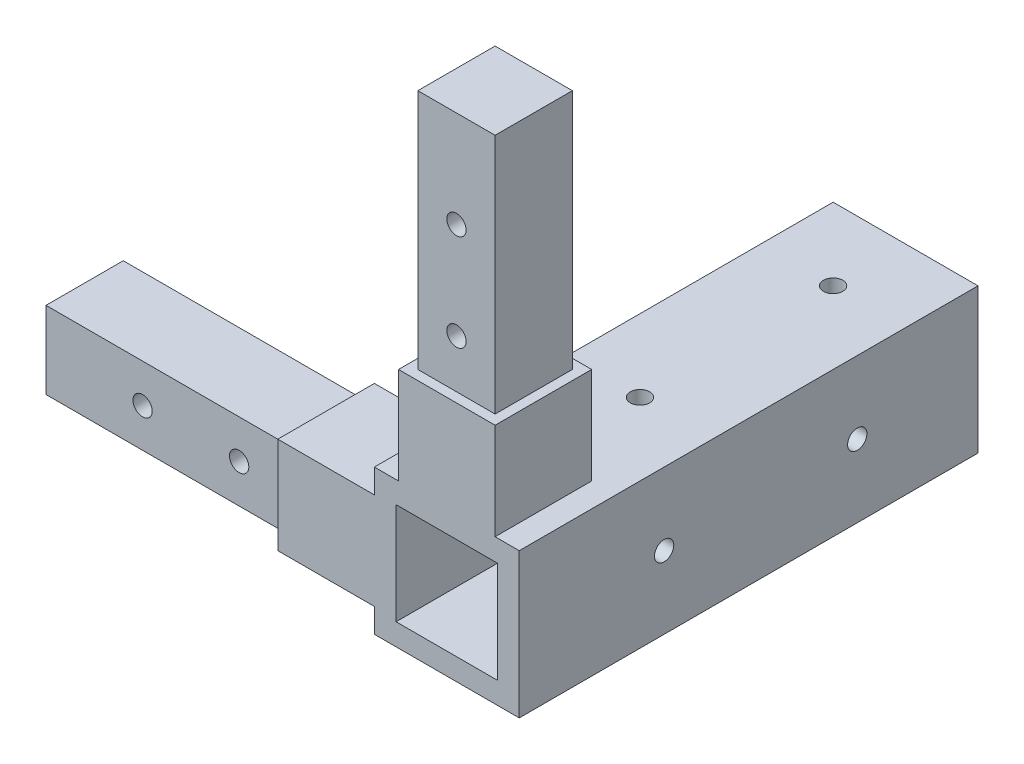
ISO-10303-21;
HEADER;
FILE_DESCRIPTION(('STEP AP214'),'2;1');
FILE_NAME('part.step','',(''),(''),'','','');
FILE_SCHEMA(('AUTOMOTIVE_DESIGN { 1 0 10303 214 1 1 1 1 }'));
ENDSEC;
DATA;
#1=APPLICATION_CONTEXT('core data for automotive mechanical design processes');
#2=APPLICATION_PROTOCOL_DEFINITION('international standard','automotive_design',2000,#1);
#3=PRODUCT_CONTEXT('',#1,'mechanical');
#4=PRODUCT('Part','Part','',(#3));
#5=PRODUCT_RELATED_PRODUCT_CATEGORY('part','',(#4));
#6=PRODUCT_DEFINITION_FORMATION('','',#4);
#7=PRODUCT_DEFINITION_CONTEXT('part definition',#1,'design');
#8=PRODUCT_DEFINITION('design','',#6,#7);
#9=PRODUCT_DEFINITION_SHAPE('','',#8);
#10=(LENGTH_UNIT() NAMED_UNIT(*) SI_UNIT(.MILLI.,.METRE.));
#11=(NAMED_UNIT(*) PLANE_ANGLE_UNIT() SI_UNIT($,.RADIAN.));
#12=(NAMED_UNIT(*) SI_UNIT($,.STERADIAN.) SOLID_ANGLE_UNIT());
#13=UNCERTAINTY_MEASURE_WITH_UNIT(LENGTH_MEASURE(1.E-05),#10,'distance_accuracy_value','');
#14=(GEOMETRIC_REPRESENTATION_CONTEXT(3) GLOBAL_UNCERTAINTY_ASSIGNED_CONTEXT((#13)) GLOBAL_UNIT_ASSIGNED_CONTEXT((#10,
#11,#12)) REPRESENTATION_CONTEXT('',''));
#15=CARTESIAN_POINT('',(0.,0.,0.));
#16=DIRECTION('',(0.,0.,1.));
#17=DIRECTION('',(1.,0.,0.));
#18=AXIS2_PLACEMENT_3D('',#15,#16,#17);
#19=CARTESIAN_POINT('',(50.,-50.,-100.));
#20=DIRECTION('',(1.,0.,0.));
#21=DIRECTION('',(0.,0.,-1.));
#22=AXIS2_PLACEMENT_3D('',#19,#20,#21);
#23=PLANE('',#22);
#24=CARTESIAN_POINT('',(50.,-35.,-35.));
#25=DIRECTION('',(1.,0.,0.));
#26=DIRECTION('',(0.,0.,-1.));
#27=AXIS2_PLACEMENT_3D('',#24,#25,#26);
#28=CIRCLE('',#27,2.);
#29=CARTESIAN_POINT('',(50.,-35.,-37.));
#30=VERTEX_POINT('',#29);
#31=EDGE_CURVE('E539',#30,#30,#28,.T.);
#32=ORIENTED_EDGE('',*,*,#31,.F.);
#33=EDGE_LOOP('',(#32));
#34=FACE_BOUND('',#33,.T.);
#35=CARTESIAN_POINT('',(50.,-35.,-75.));
#36=DIRECTION('',(1.,0.,0.));
#37=DIRECTION('',(0.,0.,-1.));
#38=AXIS2_PLACEMENT_3D('',#35,#36,#37);
#39=CIRCLE('',#38,2.);
#40=CARTESIAN_POINT('',(50.,-35.,-77.));
#41=VERTEX_POINT('',#40);
#42=EDGE_CURVE('E240',#41,#41,#39,.T.);
#43=ORIENTED_EDGE('',*,*,#42,.F.);
#44=EDGE_LOOP('',(#43));
#45=FACE_BOUND('',#44,.T.);
#46=DIRECTION('',(0.,0.,-1.));
#47=VECTOR('',#46,1.);
#48=CARTESIAN_POINT('',(50.,-20.,-30.));
#49=LINE('',#48,#47);
#50=CARTESIAN_POINT('',(50.,-20.,-5.));
#51=VERTEX_POINT('',#50);
#52=CARTESIAN_POINT('',(50.,-20.,-100.));
#53=VERTEX_POINT('',#52);
#54=EDGE_CURVE('E210',#51,#53,#49,.T.);
#55=ORIENTED_EDGE('',*,*,#54,.F.);
#56=DIRECTION('',(0.,1.,0.));
#57=VECTOR('',#56,1.);
#58=CARTESIAN_POINT('',(50.,-20.,-5.));
#59=LINE('',#58,#57);
#60=CARTESIAN_POINT('',(50.,-50.,-5.));
#61=VERTEX_POINT('',#60);
#62=EDGE_CURVE('E193',#61,#51,#59,.T.);
#63=ORIENTED_EDGE('',*,*,#62,.F.);
#64=DIRECTION('',(0.,0.,1.));
#65=VECTOR('',#64,1.);
#66=CARTESIAN_POINT('',(50.,-50.,-100.));
#67=LINE('',#66,#65);
#68=CARTESIAN_POINT('',(50.,-50.,-100.));
#69=VERTEX_POINT('',#68);
#70=EDGE_CURVE('E11',#69,#61,#67,.T.);
#71=ORIENTED_EDGE('',*,*,#70,.F.);
#72=DIRECTION('',(0.,1.,0.));
#73=VECTOR('',#72,1.);
#74=CARTESIAN_POINT('',(50.,-50.,-100.));
#75=LINE('',#74,#73);
#76=EDGE_CURVE('E41',#69,#53,#75,.T.);
#77=ORIENTED_EDGE('',*,*,#76,.T.);
#78=EDGE_LOOP('',(#55,#63,#71,#77));
#79=FACE_BOUND('',#78,.T.);
#80=ADVANCED_FACE('F32',(#34,#45,#79),#23,.T.);
#81=CARTESIAN_POINT('',(20.,-50.,-30.));
#82=DIRECTION('',(1.,0.,0.));
#83=DIRECTION('',(0.,0.,-1.));
#84=AXIS2_PLACEMENT_3D('',#81,#82,#83);
#85=PLANE('',#84);
#86=CARTESIAN_POINT('',(20.,-35.,-75.));
#87=DIRECTION('',(1.,0.,0.));
#88=DIRECTION('',(0.,0.,-1.));
#89=AXIS2_PLACEMENT_3D('',#86,#87,#88);
#90=CIRCLE('',#89,2.);
#91=CARTESIAN_POINT('',(20.,-35.,-77.));
#92=VERTEX_POINT('',#91);
#93=EDGE_CURVE('E233',#92,#92,#90,.T.);
#94=ORIENTED_EDGE('',*,*,#93,.T.);
#95=EDGE_LOOP('',(#94));
#96=FACE_BOUND('',#95,.T.);
#97=CARTESIAN_POINT('',(20.,-35.,-35.));
#98=DIRECTION('',(1.,0.,0.));
#99=DIRECTION('',(0.,0.,-1.));
#100=AXIS2_PLACEMENT_3D('',#97,#98,#99);
#101=CIRCLE('',#100,2.);
#102=CARTESIAN_POINT('',(20.,-35.,-37.));
#103=VERTEX_POINT('',#102);
#104=EDGE_CURVE('E542',#103,#103,#101,.T.);
#105=ORIENTED_EDGE('',*,*,#104,.T.);
#106=EDGE_LOOP('',(#105));
#107=FACE_BOUND('',#106,.T.);
#108=DIRECTION('',(0.,-1.,0.));
#109=VECTOR('',#108,1.);
#110=CARTESIAN_POINT('',(20.,-20.,-5.));
#111=LINE('',#110,#109);
#112=CARTESIAN_POINT('',(20.,-20.,-5.));
#113=VERTEX_POINT('',#112);
#114=CARTESIAN_POINT('',(20.,-25.,-5.));
#115=VERTEX_POINT('',#114);
#116=EDGE_CURVE('E922',#113,#115,#111,.T.);
#117=ORIENTED_EDGE('',*,*,#116,.F.);
#118=DIRECTION('',(0.,0.,-1.));
#119=VECTOR('',#118,1.);
#120=CARTESIAN_POINT('',(20.,-20.,-30.));
#121=LINE('',#120,#119);
#122=CARTESIAN_POINT('',(20.,-20.,-100.));
#123=VERTEX_POINT('',#122);
#124=EDGE_CURVE('E218',#113,#123,#121,.T.);
#125=ORIENTED_EDGE('',*,*,#124,.T.);
#126=DIRECTION('',(0.,-1.,0.));
#127=VECTOR('',#126,1.);
#128=CARTESIAN_POINT('',(20.,-50.,-100.));
#129=LINE('',#128,#127);
#130=CARTESIAN_POINT('',(20.,-50.,-100.));
#131=VERTEX_POINT('',#130);
#132=EDGE_CURVE('E219',#123,#131,#129,.T.);
#133=ORIENTED_EDGE('',*,*,#132,.T.);
#134=DIRECTION('',(0.,0.,-1.));
#135=VECTOR('',#134,1.);
#136=CARTESIAN_POINT('',(20.,-50.,-30.));
#137=LINE('',#136,#135);
#138=CARTESIAN_POINT('',(20.,-50.,-5.));
#139=VERTEX_POINT('',#138);
#140=EDGE_CURVE('E221',#139,#131,#137,.T.);
#141=ORIENTED_EDGE('',*,*,#140,.F.);
#142=CARTESIAN_POINT('',(20.,-45.,-5.));
#143=VERTEX_POINT('',#142);
#144=EDGE_CURVE('E57',#143,#139,#111,.T.);
#145=ORIENTED_EDGE('',*,*,#144,.F.);
#146=DIRECTION('',(0.,0.,1.));
#147=VECTOR('',#146,1.);
#148=CARTESIAN_POINT('',(20.,-45.,-25.));
#149=LINE('',#148,#147);
#150=CARTESIAN_POINT('',(20.,-45.,-25.));
#151=VERTEX_POINT('',#150);
#152=EDGE_CURVE('E340',#151,#143,#149,.T.);
#153=ORIENTED_EDGE('',*,*,#152,.F.);
#154=DIRECTION('',(0.,-1.,0.));
#155=VECTOR('',#154,1.);
#156=CARTESIAN_POINT('',(20.,-25.,-25.));
#157=LINE('',#156,#155);
#158=CARTESIAN_POINT('',(20.,-25.,-25.));
#159=VERTEX_POINT('',#158);
#160=EDGE_CURVE('E336',#159,#151,#157,.T.);
#161=ORIENTED_EDGE('',*,*,#160,.F.);
#162=DIRECTION('',(0.,0.,-1.));
#163=VECTOR('',#162,1.);
#164=CARTESIAN_POINT('',(20.,-25.,-25.));
#165=LINE('',#164,#163);
#166=EDGE_CURVE('E333',#115,#159,#165,.T.);
#167=ORIENTED_EDGE('',*,*,#166,.F.);
#168=EDGE_LOOP('',(#117,#125,#133,#141,#145,#153,#161,#167));
#169=FACE_BOUND('',#168,.T.);
#170=ADVANCED_FACE('F422',(#96,#107,#169),#85,.F.);
#171=CARTESIAN_POINT('',(24.5,-24.5,0.));
#172=DIRECTION('',(0.,1.,0.));
#173=DIRECTION('',(0.,0.,1.));
#174=AXIS2_PLACEMENT_3D('',#171,#172,#173);
#175=PLANE('',#174);
#176=CARTESIAN_POINT('',(35.,-24.5,-85.));
#177=DIRECTION('',(0.,1.,0.));
#178=DIRECTION('',(0.,0.,1.));
#179=AXIS2_PLACEMENT_3D('',#176,#177,#178);
#180=CIRCLE('',#179,2.);
#181=CARTESIAN_POINT('',(35.,-24.5,-83.));
#182=VERTEX_POINT('',#181);
#183=EDGE_CURVE('E270',#182,#182,#180,.T.);
#184=ORIENTED_EDGE('',*,*,#183,.T.);
#185=EDGE_LOOP('',(#184));
#186=FACE_BOUND('',#185,.T.);
#187=CARTESIAN_POINT('',(35.,-24.5,-45.));
#188=DIRECTION('',(0.,1.,0.));
#189=DIRECTION('',(0.,0.,1.));
#190=AXIS2_PLACEMENT_3D('',#187,#188,#189);
#191=CIRCLE('',#190,2.);
#192=CARTESIAN_POINT('',(35.,-24.5,-43.));
#193=VERTEX_POINT('',#192);
#194=EDGE_CURVE('E258',#193,#193,#191,.T.);
#195=ORIENTED_EDGE('',*,*,#194,.T.);
#196=EDGE_LOOP('',(#195));
#197=FACE_BOUND('',#196,.T.);
#198=DIRECTION('',(1.,0.,0.));
#199=VECTOR('',#198,1.);
#200=CARTESIAN_POINT('',(24.5,-24.5,-5.));
#201=LINE('',#200,#199);
#202=CARTESIAN_POINT('',(24.5,-24.5,-5.));
#203=VERTEX_POINT('',#202);
#204=CARTESIAN_POINT('',(45.5,-24.5,-5.));
#205=VERTEX_POINT('',#204);
#206=EDGE_CURVE('E49',#203,#205,#201,.T.);
#207=ORIENTED_EDGE('',*,*,#206,.F.);
#208=DIRECTION('',(0.,0.,-1.));
#209=VECTOR('',#208,1.);
#210=CARTESIAN_POINT('',(24.5,-24.5,0.));
#211=LINE('',#210,#209);
#212=CARTESIAN_POINT('',(24.5,-24.5,-100.));
#213=VERTEX_POINT('',#212);
#214=EDGE_CURVE('E410',#203,#213,#211,.T.);
#215=ORIENTED_EDGE('',*,*,#214,.T.);
#216=DIRECTION('',(1.,0.,0.));
#217=VECTOR('',#216,1.);
#218=CARTESIAN_POINT('',(24.5,-24.5,-100.));
#219=LINE('',#218,#217);
#220=CARTESIAN_POINT('',(45.5,-24.5,-100.));
#221=VERTEX_POINT('',#220);
#222=EDGE_CURVE('E404',#213,#221,#219,.T.);
#223=ORIENTED_EDGE('',*,*,#222,.T.);
#224=DIRECTION('',(0.,0.,-1.));
#225=VECTOR('',#224,1.);
#226=CARTESIAN_POINT('',(45.5,-24.5,0.));
#227=LINE('',#226,#225);
#228=EDGE_CURVE('E408',#205,#221,#227,.T.);
#229=ORIENTED_EDGE('',*,*,#228,.F.);
#230=EDGE_LOOP('',(#207,#215,#223,#229));
#231=FACE_BOUND('',#230,.T.);
#232=ADVANCED_FACE('F463',(#186,#197,#231),#175,.F.);
#233=CARTESIAN_POINT('',(24.5,-45.5,0.));
#234=DIRECTION('',(-1.,0.,0.));
#235=DIRECTION('',(0.,0.,1.));
#236=AXIS2_PLACEMENT_3D('',#233,#234,#235);
#237=PLANE('',#236);
#238=CARTESIAN_POINT('',(24.5,-35.,-75.));
#239=DIRECTION('',(-1.,0.,0.));
#240=DIRECTION('',(0.,0.,1.));
#241=AXIS2_PLACEMENT_3D('',#238,#239,#240);
#242=CIRCLE('',#241,2.);
#243=CARTESIAN_POINT('',(24.5,-35.,-73.));
#244=VERTEX_POINT('',#243);
#245=EDGE_CURVE('E232',#244,#244,#242,.T.);
#246=ORIENTED_EDGE('',*,*,#245,.T.);
#247=EDGE_LOOP('',(#246));
#248=FACE_BOUND('',#247,.T.);
#249=CARTESIAN_POINT('',(24.5,-35.,-35.));
#250=DIRECTION('',(-1.,0.,0.));
#251=DIRECTION('',(0.,0.,1.));
#252=AXIS2_PLACEMENT_3D('',#249,#250,#251);
#253=CIRCLE('',#252,2.);
#254=CARTESIAN_POINT('',(24.5,-35.,-33.));
#255=VERTEX_POINT('',#254);
#256=EDGE_CURVE('E245',#255,#255,#253,.T.);
#257=ORIENTED_EDGE('',*,*,#256,.T.);
#258=EDGE_LOOP('',(#257));
#259=FACE_BOUND('',#258,.T.);
#260=DIRECTION('',(0.,1.,0.));
#261=VECTOR('',#260,1.);
#262=CARTESIAN_POINT('',(24.5,-45.5,-5.));
#263=LINE('',#262,#261);
#264=CARTESIAN_POINT('',(24.5,-45.5,-5.));
#265=VERTEX_POINT('',#264);
#266=EDGE_CURVE('E502',#265,#203,#263,.T.);
#267=ORIENTED_EDGE('',*,*,#266,.F.);
#268=DIRECTION('',(0.,0.,-1.));
#269=VECTOR('',#268,1.);
#270=CARTESIAN_POINT('',(24.5,-45.5,0.));
#271=LINE('',#270,#269);
#272=CARTESIAN_POINT('',(24.5,-45.5,-100.));
#273=VERTEX_POINT('',#272);
#274=EDGE_CURVE('E412',#265,#273,#271,.T.);
#275=ORIENTED_EDGE('',*,*,#274,.T.);
#276=DIRECTION('',(0.,1.,0.));
#277=VECTOR('',#276,1.);
#278=CARTESIAN_POINT('',(24.5,-45.5,-100.));
#279=LINE('',#278,#277);
#280=EDGE_CURVE('E401',#273,#213,#279,.T.);
#281=ORIENTED_EDGE('',*,*,#280,.T.);
#282=ORIENTED_EDGE('',*,*,#214,.F.);
#283=EDGE_LOOP('',(#267,#275,#281,#282));
#284=FACE_BOUND('',#283,.T.);
#285=ADVANCED_FACE('F493',(#248,#259,#284),#237,.F.);
#286=CARTESIAN_POINT('',(24.5,-45.5,0.));
#287=DIRECTION('',(0.,-1.,0.));
#288=DIRECTION('',(0.,0.,-1.));
#289=AXIS2_PLACEMENT_3D('',#286,#287,#288);
#290=PLANE('',#289);
#291=CARTESIAN_POINT('',(35.,-45.5,-85.));
#292=DIRECTION('',(0.,-1.,0.));
#293=DIRECTION('',(0.,0.,-1.));
#294=AXIS2_PLACEMENT_3D('',#291,#292,#293);
#295=CIRCLE('',#294,2.);
#296=CARTESIAN_POINT('',(35.,-45.5,-87.));
#297=VERTEX_POINT('',#296);
#298=EDGE_CURVE('E265',#297,#297,#295,.T.);
#299=ORIENTED_EDGE('',*,*,#298,.T.);
#300=EDGE_LOOP('',(#299));
#301=FACE_BOUND('',#300,.T.);
#302=CARTESIAN_POINT('',(35.,-45.5,-45.));
#303=DIRECTION('',(0.,-1.,0.));
#304=DIRECTION('',(0.,0.,-1.));
#305=AXIS2_PLACEMENT_3D('',#302,#303,#304);
#306=CIRCLE('',#305,2.);
#307=CARTESIAN_POINT('',(35.,-45.5,-47.));
#308=VERTEX_POINT('',#307);
#309=EDGE_CURVE('E253',#308,#308,#306,.T.);
#310=ORIENTED_EDGE('',*,*,#309,.T.);
#311=EDGE_LOOP('',(#310));
#312=FACE_BOUND('',#311,.T.);
#313=DIRECTION('',(-1.,0.,0.));
#314=VECTOR('',#313,1.);
#315=CARTESIAN_POINT('',(24.5,-45.5,-5.));
#316=LINE('',#315,#314);
#317=CARTESIAN_POINT('',(45.5,-45.5,-5.));
#318=VERTEX_POINT('',#317);
#319=EDGE_CURVE('E499',#318,#265,#316,.T.);
#320=ORIENTED_EDGE('',*,*,#319,.F.);
#321=DIRECTION('',(0.,0.,-1.));
#322=VECTOR('',#321,1.);
#323=CARTESIAN_POINT('',(45.5,-45.5,0.));
#324=LINE('',#323,#322);
#325=CARTESIAN_POINT('',(45.5,-45.5,-100.));
#326=VERTEX_POINT('',#325);
#327=EDGE_CURVE('E407',#318,#326,#324,.T.);
#328=ORIENTED_EDGE('',*,*,#327,.T.);
#329=DIRECTION('',(-1.,0.,0.));
#330=VECTOR('',#329,1.);
#331=CARTESIAN_POINT('',(24.5,-45.5,-100.));
#332=LINE('',#331,#330);
#333=EDGE_CURVE('E398',#326,#273,#332,.T.);
#334=ORIENTED_EDGE('',*,*,#333,.T.);
#335=ORIENTED_EDGE('',*,*,#274,.F.);
#336=EDGE_LOOP('',(#320,#328,#334,#335));
#337=FACE_BOUND('',#336,.T.);
#338=ADVANCED_FACE('F490',(#301,#312,#337),#290,.F.);
#339=CARTESIAN_POINT('',(45.5,-45.5,0.));
#340=DIRECTION('',(1.,0.,0.));
#341=DIRECTION('',(0.,0.,-1.));
#342=AXIS2_PLACEMENT_3D('',#339,#340,#341);
#343=PLANE('',#342);
#344=CARTESIAN_POINT('',(45.5,-35.,-75.));
#345=DIRECTION('',(1.,0.,0.));
#346=DIRECTION('',(0.,0.,-1.));
#347=AXIS2_PLACEMENT_3D('',#344,#345,#346);
#348=CIRCLE('',#347,2.);
#349=CARTESIAN_POINT('',(45.5,-35.,-77.));
#350=VERTEX_POINT('',#349);
#351=EDGE_CURVE('E230',#350,#350,#348,.T.);
#352=ORIENTED_EDGE('',*,*,#351,.T.);
#353=EDGE_LOOP('',(#352));
#354=FACE_BOUND('',#353,.T.);
#355=CARTESIAN_POINT('',(45.5,-35.,-35.));
#356=DIRECTION('',(1.,0.,0.));
#357=DIRECTION('',(0.,0.,-1.));
#358=AXIS2_PLACEMENT_3D('',#355,#356,#357);
#359=CIRCLE('',#358,2.);
#360=CARTESIAN_POINT('',(45.5,-35.,-37.));
#361=VERTEX_POINT('',#360);
#362=EDGE_CURVE('E36',#361,#361,#359,.T.);
#363=ORIENTED_EDGE('',*,*,#362,.T.);
#364=EDGE_LOOP('',(#363));
#365=FACE_BOUND('',#364,.T.);
#366=DIRECTION('',(0.,-1.,0.));
#367=VECTOR('',#366,1.);
#368=CARTESIAN_POINT('',(45.5,-45.5,-5.));
#369=LINE('',#368,#367);
#370=EDGE_CURVE('E503',#205,#318,#369,.T.);
#371=ORIENTED_EDGE('',*,*,#370,.F.);
#372=ORIENTED_EDGE('',*,*,#228,.T.);
#373=DIRECTION('',(0.,-1.,0.));
#374=VECTOR('',#373,1.);
#375=CARTESIAN_POINT('',(45.5,-45.5,-100.));
#376=LINE('',#375,#374);
#377=EDGE_CURVE('E389',#221,#326,#376,.T.);
#378=ORIENTED_EDGE('',*,*,#377,.T.);
#379=ORIENTED_EDGE('',*,*,#327,.F.);
#380=EDGE_LOOP('',(#371,#372,#378,#379));
#381=FACE_BOUND('',#380,.T.);
#382=ADVANCED_FACE('F476',(#354,#365,#381),#343,.F.);
#383=CARTESIAN_POINT('',(20.,-20.,-30.));
#384=DIRECTION('',(0.,-1.,0.));
#385=DIRECTION('',(0.,0.,-1.));
#386=AXIS2_PLACEMENT_3D('',#383,#384,#385);
#387=PLANE('',#386);
#388=CARTESIAN_POINT('',(35.,-20.,-85.));
#389=DIRECTION('',(0.,1.,0.));
#390=DIRECTION('',(0.,0.,1.));
#391=AXIS2_PLACEMENT_3D('',#388,#389,#390);
#392=CIRCLE('',#391,2.);
#393=CARTESIAN_POINT('',(35.,-20.,-83.));
#394=VERTEX_POINT('',#393);
#395=EDGE_CURVE('E261',#394,#394,#392,.T.);
#396=ORIENTED_EDGE('',*,*,#395,.F.);
#397=EDGE_LOOP('',(#396));
#398=FACE_BOUND('',#397,.T.);
#399=CARTESIAN_POINT('',(35.,-20.,-45.));
#400=DIRECTION('',(0.,1.,0.));
#401=DIRECTION('',(0.,0.,1.));
#402=AXIS2_PLACEMENT_3D('',#399,#400,#401);
#403=CIRCLE('',#402,2.);
#404=CARTESIAN_POINT('',(35.,-20.,-43.));
#405=VERTEX_POINT('',#404);
#406=EDGE_CURVE('E237',#405,#405,#403,.T.);
#407=ORIENTED_EDGE('',*,*,#406,.F.);
#408=EDGE_LOOP('',(#407));
#409=FACE_BOUND('',#408,.T.);
#410=DIRECTION('',(-1.,0.,0.));
#411=VECTOR('',#410,1.);
#412=CARTESIAN_POINT('',(20.,-20.,-5.));
#413=LINE('',#412,#411);
#414=CARTESIAN_POINT('',(45.,-20.,-5.));
#415=VERTEX_POINT('',#414);
#416=EDGE_CURVE('E198',#51,#415,#413,.T.);
#417=ORIENTED_EDGE('',*,*,#416,.F.);
#418=ORIENTED_EDGE('',*,*,#54,.T.);
#419=DIRECTION('',(-1.,0.,0.));
#420=VECTOR('',#419,1.);
#421=CARTESIAN_POINT('',(20.,-20.,-100.));
#422=LINE('',#421,#420);
#423=EDGE_CURVE('E224',#53,#123,#422,.T.);
#424=ORIENTED_EDGE('',*,*,#423,.T.);
#425=ORIENTED_EDGE('',*,*,#124,.F.);
#426=CARTESIAN_POINT('',(25.,-20.,-5.));
#427=VERTEX_POINT('',#426);
#428=EDGE_CURVE('E204',#427,#113,#413,.T.);
#429=ORIENTED_EDGE('',*,*,#428,.F.);
#430=DIRECTION('',(0.,0.,1.));
#431=VECTOR('',#430,1.);
#432=CARTESIAN_POINT('',(25.,-20.,-25.));
#433=LINE('',#432,#431);
#434=CARTESIAN_POINT('',(25.,-20.,-25.));
#435=VERTEX_POINT('',#434);
#436=EDGE_CURVE('E318',#435,#427,#433,.T.);
#437=ORIENTED_EDGE('',*,*,#436,.F.);
#438=DIRECTION('',(-1.,0.,0.));
#439=VECTOR('',#438,1.);
#440=CARTESIAN_POINT('',(25.,-20.,-25.));
#441=LINE('',#440,#439);
#442=CARTESIAN_POINT('',(45.,-20.,-25.));
#443=VERTEX_POINT('',#442);
#444=EDGE_CURVE('E315',#443,#435,#441,.T.);
#445=ORIENTED_EDGE('',*,*,#444,.F.);
#446=DIRECTION('',(0.,0.,-1.));
#447=VECTOR('',#446,1.);
#448=CARTESIAN_POINT('',(45.,-20.,-25.));
#449=LINE('',#448,#447);
#450=EDGE_CURVE('E214',#415,#443,#449,.T.);
#451=ORIENTED_EDGE('',*,*,#450,.F.);
#452=EDGE_LOOP('',(#417,#418,#424,#425,#429,#437,#445,#451));
#453=FACE_BOUND('',#452,.T.);
#454=ADVANCED_FACE('F208',(#398,#409,#453),#387,.F.);
#455=CARTESIAN_POINT('',(50.,-50.,-100.));
#456=DIRECTION('',(0.,-1.,0.));
#457=DIRECTION('',(1.,0.,0.));
#458=AXIS2_PLACEMENT_3D('',#455,#456,#457);
#459=PLANE('',#458);
#460=CARTESIAN_POINT('',(35.,-50.,-45.));
#461=DIRECTION('',(0.,1.,0.));
#462=DIRECTION('',(0.,0.,1.));
#463=AXIS2_PLACEMENT_3D('',#460,#461,#462);
#464=CIRCLE('',#463,2.);
#465=CARTESIAN_POINT('',(35.,-50.,-43.));
#466=VERTEX_POINT('',#465);
#467=EDGE_CURVE('E250',#466,#466,#464,.T.);
#468=ORIENTED_EDGE('',*,*,#467,.T.);
#469=EDGE_LOOP('',(#468));
#470=FACE_BOUND('',#469,.T.);
#471=CARTESIAN_POINT('',(35.,-50.,-85.));
#472=DIRECTION('',(0.,1.,0.));
#473=DIRECTION('',(0.,0.,1.));
#474=AXIS2_PLACEMENT_3D('',#471,#472,#473);
#475=CIRCLE('',#474,2.);
#476=CARTESIAN_POINT('',(35.,-50.,-83.));
#477=VERTEX_POINT('',#476);
#478=EDGE_CURVE('E262',#477,#477,#475,.T.);
#479=ORIENTED_EDGE('',*,*,#478,.T.);
#480=EDGE_LOOP('',(#479));
#481=FACE_BOUND('',#480,.T.);
#482=ORIENTED_EDGE('',*,*,#70,.T.);
#483=DIRECTION('',(1.,0.,0.));
#484=VECTOR('',#483,1.);
#485=CARTESIAN_POINT('',(20.,-50.,-5.));
#486=LINE('',#485,#484);
#487=EDGE_CURVE('E200',#139,#61,#486,.T.);
#488=ORIENTED_EDGE('',*,*,#487,.F.);
#489=ORIENTED_EDGE('',*,*,#140,.T.);
#490=DIRECTION('',(1.,0.,0.));
#491=VECTOR('',#490,1.);
#492=CARTESIAN_POINT('',(50.,-50.,-100.));
#493=LINE('',#492,#491);
#494=EDGE_CURVE('E228',#131,#69,#493,.T.);
#495=ORIENTED_EDGE('',*,*,#494,.T.);
#496=EDGE_LOOP('',(#482,#488,#489,#495));
#497=FACE_BOUND('',#496,.T.);
#498=ADVANCED_FACE('F417',(#470,#481,#497),#459,.T.);
#499=CARTESIAN_POINT('',(45.,-20.,-25.));
#500=DIRECTION('',(1.,0.,0.));
#501=DIRECTION('',(0.,1.,0.));
#502=AXIS2_PLACEMENT_3D('',#499,#500,#501);
#503=PLANE('',#502);
#504=DIRECTION('',(0.,1.,0.));
#505=VECTOR('',#504,1.);
#506=CARTESIAN_POINT('',(45.,-20.,-25.));
#507=LINE('',#506,#505);
#508=CARTESIAN_POINT('',(45.,0.,-25.));
#509=VERTEX_POINT('',#508);
#510=EDGE_CURVE('E321',#443,#509,#507,.T.);
#511=ORIENTED_EDGE('',*,*,#510,.T.);
#512=DIRECTION('',(0.,0.,-1.));
#513=VECTOR('',#512,1.);
#514=CARTESIAN_POINT('',(45.,0.,-25.));
#515=LINE('',#514,#513);
#516=CARTESIAN_POINT('',(45.,0.,-5.));
#517=VERTEX_POINT('',#516);
#518=EDGE_CURVE('E310',#517,#509,#515,.T.);
#519=ORIENTED_EDGE('',*,*,#518,.F.);
#520=DIRECTION('',(0.,1.,0.));
#521=VECTOR('',#520,1.);
#522=CARTESIAN_POINT('',(45.,-20.,-5.));
#523=LINE('',#522,#521);
#524=EDGE_CURVE('E322',#415,#517,#523,.T.);
#525=ORIENTED_EDGE('',*,*,#524,.F.);
#526=ORIENTED_EDGE('',*,*,#450,.T.);
#527=EDGE_LOOP('',(#511,#519,#525,#526));
#528=FACE_BOUND('',#527,.T.);
#529=ADVANCED_FACE('F436',(#528),#503,.T.);
#530=CARTESIAN_POINT('',(25.,-20.,-25.));
#531=DIRECTION('',(-1.,0.,0.));
#532=DIRECTION('',(0.,-1.,0.));
#533=AXIS2_PLACEMENT_3D('',#530,#531,#532);
#534=PLANE('',#533);
#535=DIRECTION('',(0.,1.,0.));
#536=VECTOR('',#535,1.);
#537=CARTESIAN_POINT('',(25.,-20.,-5.));
#538=LINE('',#537,#536);
#539=CARTESIAN_POINT('',(25.,0.,-5.));
#540=VERTEX_POINT('',#539);
#541=EDGE_CURVE('E325',#427,#540,#538,.T.);
#542=ORIENTED_EDGE('',*,*,#541,.T.);
#543=DIRECTION('',(0.,0.,1.));
#544=VECTOR('',#543,1.);
#545=CARTESIAN_POINT('',(25.,0.,-25.));
#546=LINE('',#545,#544);
#547=CARTESIAN_POINT('',(25.,0.,-25.));
#548=VERTEX_POINT('',#547);
#549=EDGE_CURVE('E300',#548,#540,#546,.T.);
#550=ORIENTED_EDGE('',*,*,#549,.F.);
#551=DIRECTION('',(0.,1.,0.));
#552=VECTOR('',#551,1.);
#553=CARTESIAN_POINT('',(25.,-20.,-25.));
#554=LINE('',#553,#552);
#555=EDGE_CURVE('E328',#435,#548,#554,.T.);
#556=ORIENTED_EDGE('',*,*,#555,.F.);
#557=ORIENTED_EDGE('',*,*,#436,.T.);
#558=EDGE_LOOP('',(#542,#550,#556,#557));
#559=FACE_BOUND('',#558,.T.);
#560=ADVANCED_FACE('F431',(#559),#534,.T.);
#561=CARTESIAN_POINT('',(25.,-20.,-25.));
#562=DIRECTION('',(0.,0.,-1.));
#563=DIRECTION('',(-1.,0.,0.));
#564=AXIS2_PLACEMENT_3D('',#561,#562,#563);
#565=PLANE('',#564);
#566=ORIENTED_EDGE('',*,*,#555,.T.);
#567=DIRECTION('',(-1.,0.,0.));
#568=VECTOR('',#567,1.);
#569=CARTESIAN_POINT('',(25.,0.,-25.));
#570=LINE('',#569,#568);
#571=EDGE_CURVE('E312',#509,#548,#570,.T.);
#572=ORIENTED_EDGE('',*,*,#571,.F.);
#573=ORIENTED_EDGE('',*,*,#510,.F.);
#574=ORIENTED_EDGE('',*,*,#444,.T.);
#575=EDGE_LOOP('',(#566,#572,#573,#574));
#576=FACE_BOUND('',#575,.T.);
#577=ADVANCED_FACE('F434',(#576),#565,.T.);
#578=CARTESIAN_POINT('',(0.,0.,0.));
#579=DIRECTION('',(-1.,0.,0.));
#580=DIRECTION('',(0.,0.,1.));
#581=AXIS2_PLACEMENT_3D('',#578,#579,#580);
#582=PLANE('',#581);
#583=DIRECTION('',(0.,0.,1.));
#584=VECTOR('',#583,1.);
#585=CARTESIAN_POINT('',(0.,-43.,-23.));
#586=LINE('',#585,#584);
#587=CARTESIAN_POINT('',(0.,-43.,-23.));
#588=VERTEX_POINT('',#587);
#589=CARTESIAN_POINT('',(0.,-43.,-7.));
#590=VERTEX_POINT('',#589);
#591=EDGE_CURVE('E373',#588,#590,#586,.T.);
#592=ORIENTED_EDGE('',*,*,#591,.F.);
#593=DIRECTION('',(0.,-1.,0.));
#594=VECTOR('',#593,1.);
#595=CARTESIAN_POINT('',(0.,-27.,-23.));
#596=LINE('',#595,#594);
#597=CARTESIAN_POINT('',(0.,-27.,-23.));
#598=VERTEX_POINT('',#597);
#599=EDGE_CURVE('E370',#598,#588,#596,.T.);
#600=ORIENTED_EDGE('',*,*,#599,.F.);
#601=DIRECTION('',(0.,0.,-1.));
#602=VECTOR('',#601,1.);
#603=CARTESIAN_POINT('',(0.,-27.,-23.));
#604=LINE('',#603,#602);
#605=CARTESIAN_POINT('',(0.,-27.,-7.));
#606=VERTEX_POINT('',#605);
#607=EDGE_CURVE('E366',#606,#598,#604,.T.);
#608=ORIENTED_EDGE('',*,*,#607,.F.);
#609=DIRECTION('',(0.,1.,0.));
#610=VECTOR('',#609,1.);
#611=CARTESIAN_POINT('',(0.,-27.,-7.));
#612=LINE('',#611,#610);
#613=EDGE_CURVE('E363',#590,#606,#612,.T.);
#614=ORIENTED_EDGE('',*,*,#613,.F.);
#615=EDGE_LOOP('',(#592,#600,#608,#614));
#616=FACE_BOUND('',#615,.T.);
#617=DIRECTION('',(0.,0.,1.));
#618=VECTOR('',#617,1.);
#619=CARTESIAN_POINT('',(0.,-45.,-25.));
#620=LINE('',#619,#618);
#621=CARTESIAN_POINT('',(0.,-45.,-25.));
#622=VERTEX_POINT('',#621);
#623=CARTESIAN_POINT('',(0.,-45.,-4.99999999999999));
#624=VERTEX_POINT('',#623);
#625=EDGE_CURVE('E337',#622,#624,#620,.T.);
#626=ORIENTED_EDGE('',*,*,#625,.T.);
#627=DIRECTION('',(0.,1.,0.));
#628=VECTOR('',#627,1.);
#629=CARTESIAN_POINT('',(0.,-25.,-4.99999999999999));
#630=LINE('',#629,#628);
#631=CARTESIAN_POINT('',(0.,-25.,-4.99999999999999));
#632=VERTEX_POINT('',#631);
#633=EDGE_CURVE('E324',#624,#632,#630,.T.);
#634=ORIENTED_EDGE('',*,*,#633,.T.);
#635=DIRECTION('',(0.,0.,-1.));
#636=VECTOR('',#635,1.);
#637=CARTESIAN_POINT('',(0.,-25.,-25.));
#638=LINE('',#637,#636);
#639=CARTESIAN_POINT('',(0.,-25.,-25.));
#640=VERTEX_POINT('',#639);
#641=EDGE_CURVE('E346',#632,#640,#638,.T.);
#642=ORIENTED_EDGE('',*,*,#641,.T.);
#643=DIRECTION('',(0.,-1.,0.));
#644=VECTOR('',#643,1.);
#645=CARTESIAN_POINT('',(0.,-25.,-25.));
#646=LINE('',#645,#644);
#647=EDGE_CURVE('E349',#640,#622,#646,.T.);
#648=ORIENTED_EDGE('',*,*,#647,.T.);
#649=EDGE_LOOP('',(#626,#634,#642,#648));
#650=FACE_BOUND('',#649,.T.);
#651=ADVANCED_FACE('F648',(#616,#650),#582,.T.);
#652=CARTESIAN_POINT('',(0.,-27.,-7.));
#653=DIRECTION('',(0.,0.,1.));
#654=DIRECTION('',(0.,-1.,0.));
#655=AXIS2_PLACEMENT_3D('',#652,#653,#654);
#656=PLANE('',#655);
#657=CARTESIAN_POINT('',(-10.,-35.,-7.));
#658=DIRECTION('',(0.,0.,-1.));
#659=DIRECTION('',(-1.,0.,0.));
#660=AXIS2_PLACEMENT_3D('',#657,#658,#659);
#661=CIRCLE('',#660,2.);
#662=CARTESIAN_POINT('',(-12.,-35.,-7.));
#663=VERTEX_POINT('',#662);
#664=EDGE_CURVE('E518',#663,#663,#661,.T.);
#665=ORIENTED_EDGE('',*,*,#664,.T.);
#666=EDGE_LOOP('',(#665));
#667=FACE_BOUND('',#666,.T.);
#668=CARTESIAN_POINT('',(-30.,-35.,-7.));
#669=DIRECTION('',(0.,0.,-1.));
#670=DIRECTION('',(-1.,0.,0.));
#671=AXIS2_PLACEMENT_3D('',#668,#669,#670);
#672=CIRCLE('',#671,2.);
#673=CARTESIAN_POINT('',(-32.,-35.,-7.));
#674=VERTEX_POINT('',#673);
#675=EDGE_CURVE('E524',#674,#674,#672,.T.);
#676=ORIENTED_EDGE('',*,*,#675,.T.);
#677=EDGE_LOOP('',(#676));
#678=FACE_BOUND('',#677,.T.);
#679=DIRECTION('',(0.,1.,0.));
#680=VECTOR('',#679,1.);
#681=CARTESIAN_POINT('',(-50.,-27.,-7.));
#682=LINE('',#681,#680);
#683=CARTESIAN_POINT('',(-50.,-43.,-7.));
#684=VERTEX_POINT('',#683);
#685=CARTESIAN_POINT('',(-50.,-27.,-7.));
#686=VERTEX_POINT('',#685);
#687=EDGE_CURVE('E356',#684,#686,#682,.T.);
#688=ORIENTED_EDGE('',*,*,#687,.F.);
#689=DIRECTION('',(-1.,0.,0.));
#690=VECTOR('',#689,1.);
#691=CARTESIAN_POINT('',(0.,-43.,-7.));
#692=LINE('',#691,#690);
#693=EDGE_CURVE('E387',#590,#684,#692,.T.);
#694=ORIENTED_EDGE('',*,*,#693,.F.);
#695=ORIENTED_EDGE('',*,*,#613,.T.);
#696=DIRECTION('',(-1.,0.,0.));
#697=VECTOR('',#696,1.);
#698=CARTESIAN_POINT('',(0.,-27.,-7.));
#699=LINE('',#698,#697);
#700=EDGE_CURVE('E376',#606,#686,#699,.T.);
#701=ORIENTED_EDGE('',*,*,#700,.T.);
#702=EDGE_LOOP('',(#688,#694,#695,#701));
#703=FACE_BOUND('',#702,.T.);
#704=ADVANCED_FACE('F644',(#667,#678,#703),#656,.T.);
#705=CARTESIAN_POINT('',(0.,-43.,-23.));
#706=DIRECTION('',(0.,-1.,0.));
#707=DIRECTION('',(0.,0.,-1.));
#708=AXIS2_PLACEMENT_3D('',#705,#706,#707);
#709=PLANE('',#708);
#710=DIRECTION('',(0.,0.,1.));
#711=VECTOR('',#710,1.);
#712=CARTESIAN_POINT('',(-50.,-43.,-23.));
#713=LINE('',#712,#711);
#714=CARTESIAN_POINT('',(-50.,-43.,-23.));
#715=VERTEX_POINT('',#714);
#716=EDGE_CURVE('E367',#715,#684,#713,.T.);
#717=ORIENTED_EDGE('',*,*,#716,.F.);
#718=DIRECTION('',(-1.,0.,0.));
#719=VECTOR('',#718,1.);
#720=CARTESIAN_POINT('',(0.,-43.,-23.));
#721=LINE('',#720,#719);
#722=EDGE_CURVE('E390',#588,#715,#721,.T.);
#723=ORIENTED_EDGE('',*,*,#722,.F.);
#724=ORIENTED_EDGE('',*,*,#591,.T.);
#725=ORIENTED_EDGE('',*,*,#693,.T.);
#726=EDGE_LOOP('',(#717,#723,#724,#725));
#727=FACE_BOUND('',#726,.T.);
#728=ADVANCED_FACE('F632',(#727),#709,.T.);
#729=CARTESIAN_POINT('',(0.,-27.,-23.));
#730=DIRECTION('',(0.,0.,-1.));
#731=DIRECTION('',(-1.,0.,0.));
#732=AXIS2_PLACEMENT_3D('',#729,#730,#731);
#733=PLANE('',#732);
#734=CARTESIAN_POINT('',(-10.,-35.,-23.));
#735=DIRECTION('',(0.,0.,-1.));
#736=DIRECTION('',(-1.,0.,0.));
#737=AXIS2_PLACEMENT_3D('',#734,#735,#736);
#738=CIRCLE('',#737,2.);
#739=CARTESIAN_POINT('',(-12.,-35.,-23.));
#740=VERTEX_POINT('',#739);
#741=EDGE_CURVE('E514',#740,#740,#738,.T.);
#742=ORIENTED_EDGE('',*,*,#741,.F.);
#743=EDGE_LOOP('',(#742));
#744=FACE_BOUND('',#743,.T.);
#745=CARTESIAN_POINT('',(-30.,-35.,-23.));
#746=DIRECTION('',(0.,0.,-1.));
#747=DIRECTION('',(-1.,0.,0.));
#748=AXIS2_PLACEMENT_3D('',#745,#746,#747);
#749=CIRCLE('',#748,2.);
#750=CARTESIAN_POINT('',(-32.,-35.,-23.));
#751=VERTEX_POINT('',#750);
#752=EDGE_CURVE('E521',#751,#751,#749,.T.);
#753=ORIENTED_EDGE('',*,*,#752,.F.);
#754=EDGE_LOOP('',(#753));
#755=FACE_BOUND('',#754,.T.);
#756=DIRECTION('',(0.,-1.,0.));
#757=VECTOR('',#756,1.);
#758=CARTESIAN_POINT('',(-50.,-27.,-23.));
#759=LINE('',#758,#757);
#760=CARTESIAN_POINT('',(-50.,-27.,-23.));
#761=VERTEX_POINT('',#760);
#762=EDGE_CURVE('E382',#761,#715,#759,.T.);
#763=ORIENTED_EDGE('',*,*,#762,.F.);
#764=DIRECTION('',(-1.,0.,0.));
#765=VECTOR('',#764,1.);
#766=CARTESIAN_POINT('',(0.,-27.,-23.));
#767=LINE('',#766,#765);
#768=EDGE_CURVE('E392',#598,#761,#767,.T.);
#769=ORIENTED_EDGE('',*,*,#768,.F.);
#770=ORIENTED_EDGE('',*,*,#599,.T.);
#771=ORIENTED_EDGE('',*,*,#722,.T.);
#772=EDGE_LOOP('',(#763,#769,#770,#771));
#773=FACE_BOUND('',#772,.T.);
#774=ADVANCED_FACE('F628',(#744,#755,#773),#733,.T.);
#775=CARTESIAN_POINT('',(0.,-27.,-23.));
#776=DIRECTION('',(0.,1.,0.));
#777=DIRECTION('',(0.,0.,1.));
#778=AXIS2_PLACEMENT_3D('',#775,#776,#777);
#779=PLANE('',#778);
#780=DIRECTION('',(0.,0.,-1.));
#781=VECTOR('',#780,1.);
#782=CARTESIAN_POINT('',(-50.,-27.,-23.));
#783=LINE('',#782,#781);
#784=EDGE_CURVE('E379',#686,#761,#783,.T.);
#785=ORIENTED_EDGE('',*,*,#784,.F.);
#786=ORIENTED_EDGE('',*,*,#700,.F.);
#787=ORIENTED_EDGE('',*,*,#607,.T.);
#788=ORIENTED_EDGE('',*,*,#768,.T.);
#789=EDGE_LOOP('',(#785,#786,#787,#788));
#790=FACE_BOUND('',#789,.T.);
#791=ADVANCED_FACE('F631',(#790),#779,.T.);
#792=CARTESIAN_POINT('',(-50.,-50.,-100.));
#793=DIRECTION('',(-1.,0.,0.));
#794=DIRECTION('',(0.,0.,1.));
#795=AXIS2_PLACEMENT_3D('',#792,#793,#794);
#796=PLANE('',#795);
#797=ORIENTED_EDGE('',*,*,#716,.T.);
#798=ORIENTED_EDGE('',*,*,#687,.T.);
#799=ORIENTED_EDGE('',*,*,#784,.T.);
#800=ORIENTED_EDGE('',*,*,#762,.T.);
#801=EDGE_LOOP('',(#797,#798,#799,#800));
#802=FACE_BOUND('',#801,.T.);
#803=ADVANCED_FACE('F34',(#802),#796,.T.);
#804=CARTESIAN_POINT('',(20.,-25.,-4.99999999999999));
#805=DIRECTION('',(0.,0.,1.));
#806=DIRECTION('',(1.,0.,0.));
#807=AXIS2_PLACEMENT_3D('',#804,#805,#806);
#808=PLANE('',#807);
#809=ORIENTED_EDGE('',*,*,#633,.F.);
#810=DIRECTION('',(-1.,0.,0.));
#811=VECTOR('',#810,1.);
#812=CARTESIAN_POINT('',(20.,-45.,-4.99999999999999));
#813=LINE('',#812,#811);
#814=EDGE_CURVE('E354',#143,#624,#813,.T.);
#815=ORIENTED_EDGE('',*,*,#814,.F.);
#816=ORIENTED_EDGE('',*,*,#144,.T.);
#817=ORIENTED_EDGE('',*,*,#487,.T.);
#818=ORIENTED_EDGE('',*,*,#62,.T.);
#819=ORIENTED_EDGE('',*,*,#416,.T.);
#820=ORIENTED_EDGE('',*,*,#524,.T.);
#821=DIRECTION('',(1.,0.,0.));
#822=VECTOR('',#821,1.);
#823=CARTESIAN_POINT('',(25.,0.,-5.));
#824=LINE('',#823,#822);
#825=EDGE_CURVE('E308',#540,#517,#824,.T.);
#826=ORIENTED_EDGE('',*,*,#825,.F.);
#827=ORIENTED_EDGE('',*,*,#541,.F.);
#828=ORIENTED_EDGE('',*,*,#428,.T.);
#829=ORIENTED_EDGE('',*,*,#116,.T.);
#830=DIRECTION('',(-1.,0.,0.));
#831=VECTOR('',#830,1.);
#832=CARTESIAN_POINT('',(20.,-25.,-4.99999999999999));
#833=LINE('',#832,#831);
#834=EDGE_CURVE('E343',#115,#632,#833,.T.);
#835=ORIENTED_EDGE('',*,*,#834,.T.);
#836=EDGE_LOOP('',(#809,#815,#816,#817,#818,#819,#820,#826,#827,#828,#829,#835));
#837=FACE_BOUND('',#836,.T.);
#838=ORIENTED_EDGE('',*,*,#206,.T.);
#839=ORIENTED_EDGE('',*,*,#370,.T.);
#840=ORIENTED_EDGE('',*,*,#319,.T.);
#841=ORIENTED_EDGE('',*,*,#266,.T.);
#842=EDGE_LOOP('',(#838,#839,#840,#841));
#843=FACE_BOUND('',#842,.T.);
#844=ADVANCED_FACE('F196',(#837,#843),#808,.T.);
#845=CARTESIAN_POINT('',(20.,-45.,-25.));
#846=DIRECTION('',(0.,-1.,0.));
#847=DIRECTION('',(0.,0.,-1.));
#848=AXIS2_PLACEMENT_3D('',#845,#846,#847);
#849=PLANE('',#848);
#850=ORIENTED_EDGE('',*,*,#625,.F.);
#851=DIRECTION('',(-1.,0.,0.));
#852=VECTOR('',#851,1.);
#853=CARTESIAN_POINT('',(20.,-45.,-25.));
#854=LINE('',#853,#852);
#855=EDGE_CURVE('E357',#151,#622,#854,.T.);
#856=ORIENTED_EDGE('',*,*,#855,.F.);
#857=ORIENTED_EDGE('',*,*,#152,.T.);
#858=ORIENTED_EDGE('',*,*,#814,.T.);
#859=EDGE_LOOP('',(#850,#856,#857,#858));
#860=FACE_BOUND('',#859,.T.);
#861=ADVANCED_FACE('F814',(#860),#849,.T.);
#862=CARTESIAN_POINT('',(20.,-25.,-25.));
#863=DIRECTION('',(0.,0.,-1.));
#864=DIRECTION('',(-1.,0.,0.));
#865=AXIS2_PLACEMENT_3D('',#862,#863,#864);
#866=PLANE('',#865);
#867=ORIENTED_EDGE('',*,*,#647,.F.);
#868=DIRECTION('',(-1.,0.,0.));
#869=VECTOR('',#868,1.);
#870=CARTESIAN_POINT('',(20.,-25.,-25.));
#871=LINE('',#870,#869);
#872=EDGE_CURVE('E359',#159,#640,#871,.T.);
#873=ORIENTED_EDGE('',*,*,#872,.F.);
#874=ORIENTED_EDGE('',*,*,#160,.T.);
#875=ORIENTED_EDGE('',*,*,#855,.T.);
#876=EDGE_LOOP('',(#867,#873,#874,#875));
#877=FACE_BOUND('',#876,.T.);
#878=ADVANCED_FACE('F807',(#877),#866,.T.);
#879=CARTESIAN_POINT('',(20.,-25.,-25.));
#880=DIRECTION('',(0.,1.,0.));
#881=DIRECTION('',(0.,0.,1.));
#882=AXIS2_PLACEMENT_3D('',#879,#880,#881);
#883=PLANE('',#882);
#884=ORIENTED_EDGE('',*,*,#641,.F.);
#885=ORIENTED_EDGE('',*,*,#834,.F.);
#886=ORIENTED_EDGE('',*,*,#166,.T.);
#887=ORIENTED_EDGE('',*,*,#872,.T.);
#888=EDGE_LOOP('',(#884,#885,#886,#887));
#889=FACE_BOUND('',#888,.T.);
#890=ADVANCED_FACE('F451',(#889),#883,.T.);
#891=CARTESIAN_POINT('',(0.,0.,-100.));
#892=DIRECTION('',(0.,0.,1.));
#893=DIRECTION('',(1.,0.,0.));
#894=AXIS2_PLACEMENT_3D('',#891,#892,#893);
#895=PLANE('',#894);
#896=ORIENTED_EDGE('',*,*,#333,.F.);
#897=ORIENTED_EDGE('',*,*,#377,.F.);
#898=ORIENTED_EDGE('',*,*,#222,.F.);
#899=ORIENTED_EDGE('',*,*,#280,.F.);
#900=EDGE_LOOP('',(#896,#897,#898,#899));
#901=FACE_BOUND('',#900,.T.);
#902=ORIENTED_EDGE('',*,*,#494,.F.);
#903=ORIENTED_EDGE('',*,*,#132,.F.);
#904=ORIENTED_EDGE('',*,*,#423,.F.);
#905=ORIENTED_EDGE('',*,*,#76,.F.);
#906=EDGE_LOOP('',(#902,#903,#904,#905));
#907=FACE_BOUND('',#906,.T.);
#908=ADVANCED_FACE('F425',(#901,#907),#895,.F.);
#909=CARTESIAN_POINT('',(0.,0.,0.));
#910=DIRECTION('',(0.,1.,0.));
#911=DIRECTION('',(0.,0.,1.));
#912=AXIS2_PLACEMENT_3D('',#909,#910,#911);
#913=PLANE('',#912);
#914=DIRECTION('',(1.,0.,0.));
#915=VECTOR('',#914,1.);
#916=CARTESIAN_POINT('',(27.,0.,-7.));
#917=LINE('',#916,#915);
#918=CARTESIAN_POINT('',(27.,0.,-7.));
#919=VERTEX_POINT('',#918);
#920=CARTESIAN_POINT('',(43.,0.,-7.));
#921=VERTEX_POINT('',#920);
#922=EDGE_CURVE('E284',#919,#921,#917,.T.);
#923=ORIENTED_EDGE('',*,*,#922,.F.);
#924=DIRECTION('',(0.,0.,1.));
#925=VECTOR('',#924,1.);
#926=CARTESIAN_POINT('',(27.,0.,-23.));
#927=LINE('',#926,#925);
#928=CARTESIAN_POINT('',(27.,0.,-23.));
#929=VERTEX_POINT('',#928);
#930=EDGE_CURVE('E281',#929,#919,#927,.T.);
#931=ORIENTED_EDGE('',*,*,#930,.F.);
#932=DIRECTION('',(-1.,0.,0.));
#933=VECTOR('',#932,1.);
#934=CARTESIAN_POINT('',(27.,0.,-23.));
#935=LINE('',#934,#933);
#936=CARTESIAN_POINT('',(43.,0.,-23.));
#937=VERTEX_POINT('',#936);
#938=EDGE_CURVE('E277',#937,#929,#935,.T.);
#939=ORIENTED_EDGE('',*,*,#938,.F.);
#940=DIRECTION('',(0.,0.,-1.));
#941=VECTOR('',#940,1.);
#942=CARTESIAN_POINT('',(43.,0.,-23.));
#943=LINE('',#942,#941);
#944=EDGE_CURVE('E274',#921,#937,#943,.T.);
#945=ORIENTED_EDGE('',*,*,#944,.F.);
#946=EDGE_LOOP('',(#923,#931,#939,#945));
#947=FACE_BOUND('',#946,.T.);
#948=ORIENTED_EDGE('',*,*,#549,.T.);
#949=ORIENTED_EDGE('',*,*,#825,.T.);
#950=ORIENTED_EDGE('',*,*,#518,.T.);
#951=ORIENTED_EDGE('',*,*,#571,.T.);
#952=EDGE_LOOP('',(#948,#949,#950,#951));
#953=FACE_BOUND('',#952,.T.);
#954=ADVANCED_FACE('F439',(#947,#953),#913,.T.);
#955=CARTESIAN_POINT('',(43.,0.,-23.));
#956=DIRECTION('',(1.,0.,0.));
#957=DIRECTION('',(0.,1.,0.));
#958=AXIS2_PLACEMENT_3D('',#955,#956,#957);
#959=PLANE('',#958);
#960=DIRECTION('',(0.,0.,-1.));
#961=VECTOR('',#960,1.);
#962=CARTESIAN_POINT('',(43.,50.,-23.));
#963=LINE('',#962,#961);
#964=CARTESIAN_POINT('',(43.,50.,-7.));
#965=VERTEX_POINT('',#964);
#966=CARTESIAN_POINT('',(43.,50.,-23.));
#967=VERTEX_POINT('',#966);
#968=EDGE_CURVE('E273',#965,#967,#963,.T.);
#969=ORIENTED_EDGE('',*,*,#968,.F.);
#970=DIRECTION('',(0.,1.,0.));
#971=VECTOR('',#970,1.);
#972=CARTESIAN_POINT('',(43.,0.,-7.));
#973=LINE('',#972,#971);
#974=EDGE_CURVE('E298',#921,#965,#973,.T.);
#975=ORIENTED_EDGE('',*,*,#974,.F.);
#976=ORIENTED_EDGE('',*,*,#944,.T.);
#977=DIRECTION('',(0.,1.,0.));
#978=VECTOR('',#977,1.);
#979=CARTESIAN_POINT('',(43.,0.,-23.));
#980=LINE('',#979,#978);
#981=EDGE_CURVE('E287',#937,#967,#980,.T.);
#982=ORIENTED_EDGE('',*,*,#981,.T.);
#983=EDGE_LOOP('',(#969,#975,#976,#982));
#984=FACE_BOUND('',#983,.T.);
#985=ADVANCED_FACE('F441',(#984),#959,.T.);
#986=CARTESIAN_POINT('',(27.,0.,-7.));
#987=DIRECTION('',(0.,0.,1.));
#988=DIRECTION('',(1.,0.,0.));
#989=AXIS2_PLACEMENT_3D('',#986,#987,#988);
#990=PLANE('',#989);
#991=CARTESIAN_POINT('',(35.,10.,-7.00000000000001));
#992=DIRECTION('',(0.,0.,-1.));
#993=DIRECTION('',(-1.,0.,0.));
#994=AXIS2_PLACEMENT_3D('',#991,#992,#993);
#995=CIRCLE('',#994,2.);
#996=CARTESIAN_POINT('',(33.,10.,-7.00000000000001));
#997=VERTEX_POINT('',#996);
#998=EDGE_CURVE('E530',#997,#997,#995,.T.);
#999=ORIENTED_EDGE('',*,*,#998,.T.);
#1000=EDGE_LOOP('',(#999));
#1001=FACE_BOUND('',#1000,.T.);
#1002=CARTESIAN_POINT('',(35.,30.,-7.00000000000001));
#1003=DIRECTION('',(0.,0.,-1.));
#1004=DIRECTION('',(-1.,0.,0.));
#1005=AXIS2_PLACEMENT_3D('',#1002,#1003,#1004);
#1006=CIRCLE('',#1005,2.);
#1007=CARTESIAN_POINT('',(33.,30.,-7.00000000000001));
#1008=VERTEX_POINT('',#1007);
#1009=EDGE_CURVE('E536',#1008,#1008,#1006,.T.);
#1010=ORIENTED_EDGE('',*,*,#1009,.T.);
#1011=EDGE_LOOP('',(#1010));
#1012=FACE_BOUND('',#1011,.T.);
#1013=DIRECTION('',(1.,0.,0.));
#1014=VECTOR('',#1013,1.);
#1015=CARTESIAN_POINT('',(27.,50.,-7.));
#1016=LINE('',#1015,#1014);
#1017=CARTESIAN_POINT('',(27.,50.,-7.));
#1018=VERTEX_POINT('',#1017);
#1019=EDGE_CURVE('E278',#1018,#965,#1016,.T.);
#1020=ORIENTED_EDGE('',*,*,#1019,.F.);
#1021=DIRECTION('',(0.,1.,0.));
#1022=VECTOR('',#1021,1.);
#1023=CARTESIAN_POINT('',(27.,0.,-7.));
#1024=LINE('',#1023,#1022);
#1025=EDGE_CURVE('E301',#919,#1018,#1024,.T.);
#1026=ORIENTED_EDGE('',*,*,#1025,.F.);
#1027=ORIENTED_EDGE('',*,*,#922,.T.);
#1028=ORIENTED_EDGE('',*,*,#974,.T.);
#1029=EDGE_LOOP('',(#1020,#1026,#1027,#1028));
#1030=FACE_BOUND('',#1029,.T.);
#1031=ADVANCED_FACE('F448',(#1001,#1012,#1030),#990,.T.);
#1032=CARTESIAN_POINT('',(27.,0.,-23.));
#1033=DIRECTION('',(-1.,0.,0.));
#1034=DIRECTION('',(0.,-1.,0.));
#1035=AXIS2_PLACEMENT_3D('',#1032,#1033,#1034);
#1036=PLANE('',#1035);
#1037=DIRECTION('',(0.,0.,1.));
#1038=VECTOR('',#1037,1.);
#1039=CARTESIAN_POINT('',(27.,50.,-23.));
#1040=LINE('',#1039,#1038);
#1041=CARTESIAN_POINT('',(27.,50.,-23.));
#1042=VERTEX_POINT('',#1041);
#1043=EDGE_CURVE('E293',#1042,#1018,#1040,.T.);
#1044=ORIENTED_EDGE('',*,*,#1043,.F.);
#1045=DIRECTION('',(0.,1.,0.));
#1046=VECTOR('',#1045,1.);
#1047=CARTESIAN_POINT('',(27.,0.,-23.));
#1048=LINE('',#1047,#1046);
#1049=EDGE_CURVE('E303',#929,#1042,#1048,.T.);
#1050=ORIENTED_EDGE('',*,*,#1049,.F.);
#1051=ORIENTED_EDGE('',*,*,#930,.T.);
#1052=ORIENTED_EDGE('',*,*,#1025,.T.);
#1053=EDGE_LOOP('',(#1044,#1050,#1051,#1052));
#1054=FACE_BOUND('',#1053,.T.);
#1055=ADVANCED_FACE('F584',(#1054),#1036,.T.);
#1056=CARTESIAN_POINT('',(27.,0.,-23.));
#1057=DIRECTION('',(0.,0.,-1.));
#1058=DIRECTION('',(-1.,0.,0.));
#1059=AXIS2_PLACEMENT_3D('',#1056,#1057,#1058);
#1060=PLANE('',#1059);
#1061=CARTESIAN_POINT('',(35.,10.,-23.));
#1062=DIRECTION('',(0.,0.,-1.));
#1063=DIRECTION('',(-1.,0.,0.));
#1064=AXIS2_PLACEMENT_3D('',#1061,#1062,#1063);
#1065=CIRCLE('',#1064,2.);
#1066=CARTESIAN_POINT('',(33.,10.,-23.));
#1067=VERTEX_POINT('',#1066);
#1068=EDGE_CURVE('E527',#1067,#1067,#1065,.T.);
#1069=ORIENTED_EDGE('',*,*,#1068,.F.);
#1070=EDGE_LOOP('',(#1069));
#1071=FACE_BOUND('',#1070,.T.);
#1072=CARTESIAN_POINT('',(35.,30.,-23.));
#1073=DIRECTION('',(0.,0.,-1.));
#1074=DIRECTION('',(-1.,0.,0.));
#1075=AXIS2_PLACEMENT_3D('',#1072,#1073,#1074);
#1076=CIRCLE('',#1075,2.);
#1077=CARTESIAN_POINT('',(33.,30.,-23.));
#1078=VERTEX_POINT('',#1077);
#1079=EDGE_CURVE('E533',#1078,#1078,#1076,.T.);
#1080=ORIENTED_EDGE('',*,*,#1079,.F.);
#1081=EDGE_LOOP('',(#1080));
#1082=FACE_BOUND('',#1081,.T.);
#1083=DIRECTION('',(-1.,0.,0.));
#1084=VECTOR('',#1083,1.);
#1085=CARTESIAN_POINT('',(27.,50.,-23.));
#1086=LINE('',#1085,#1084);
#1087=EDGE_CURVE('E290',#967,#1042,#1086,.T.);
#1088=ORIENTED_EDGE('',*,*,#1087,.F.);
#1089=ORIENTED_EDGE('',*,*,#981,.F.);
#1090=ORIENTED_EDGE('',*,*,#938,.T.);
#1091=ORIENTED_EDGE('',*,*,#1049,.T.);
#1092=EDGE_LOOP('',(#1088,#1089,#1090,#1091));
#1093=FACE_BOUND('',#1092,.T.);
#1094=ADVANCED_FACE('F588',(#1071,#1082,#1093),#1060,.T.);
#1095=CARTESIAN_POINT('',(50.,50.,-100.));
#1096=DIRECTION('',(0.,1.,0.));
#1097=DIRECTION('',(-1.,0.,0.));
#1098=AXIS2_PLACEMENT_3D('',#1095,#1096,#1097);
#1099=PLANE('',#1098);
#1100=ORIENTED_EDGE('',*,*,#1019,.T.);
#1101=ORIENTED_EDGE('',*,*,#968,.T.);
#1102=ORIENTED_EDGE('',*,*,#1087,.T.);
#1103=ORIENTED_EDGE('',*,*,#1043,.T.);
#1104=EDGE_LOOP('',(#1100,#1101,#1102,#1103));
#1105=FACE_BOUND('',#1104,.T.);
#1106=ADVANCED_FACE('F468',(#1105),#1099,.T.);
#1107=CARTESIAN_POINT('',(35.,-50.,-85.));
#1108=DIRECTION('',(0.,1.,0.));
#1109=DIRECTION('',(0.,0.,1.));
#1110=AXIS2_PLACEMENT_3D('',#1107,#1108,#1109);
#1111=CYLINDRICAL_SURFACE('',#1110,2.);
#1112=ORIENTED_EDGE('',*,*,#478,.F.);
#1113=EDGE_LOOP('',(#1112));
#1114=FACE_BOUND('',#1113,.T.);
#1115=ORIENTED_EDGE('',*,*,#298,.F.);
#1116=EDGE_LOOP('',(#1115));
#1117=FACE_BOUND('',#1116,.T.);
#1118=ADVANCED_FACE('F483',(#1114,#1117),#1111,.F.);
#1119=ORIENTED_EDGE('',*,*,#395,.T.);
#1120=EDGE_LOOP('',(#1119));
#1121=FACE_BOUND('',#1120,.T.);
#1122=ORIENTED_EDGE('',*,*,#183,.F.);
#1123=EDGE_LOOP('',(#1122));
#1124=FACE_BOUND('',#1123,.T.);
#1125=ADVANCED_FACE('F486',(#1121,#1124),#1111,.F.);
#1126=CARTESIAN_POINT('',(35.,-50.,-45.));
#1127=DIRECTION('',(0.,1.,0.));
#1128=DIRECTION('',(0.,0.,1.));
#1129=AXIS2_PLACEMENT_3D('',#1126,#1127,#1128);
#1130=CYLINDRICAL_SURFACE('',#1129,2.);
#1131=ORIENTED_EDGE('',*,*,#467,.F.);
#1132=EDGE_LOOP('',(#1131));
#1133=FACE_BOUND('',#1132,.T.);
#1134=ORIENTED_EDGE('',*,*,#309,.F.);
#1135=EDGE_LOOP('',(#1134));
#1136=FACE_BOUND('',#1135,.T.);
#1137=ADVANCED_FACE('F577',(#1133,#1136),#1130,.F.);
#1138=ORIENTED_EDGE('',*,*,#406,.T.);
#1139=EDGE_LOOP('',(#1138));
#1140=FACE_BOUND('',#1139,.T.);
#1141=ORIENTED_EDGE('',*,*,#194,.F.);
#1142=EDGE_LOOP('',(#1141));
#1143=FACE_BOUND('',#1142,.T.);
#1144=ADVANCED_FACE('F575',(#1140,#1143),#1130,.F.);
#1145=CARTESIAN_POINT('',(20.,-35.,-75.));
#1146=DIRECTION('',(1.,0.,0.));
#1147=DIRECTION('',(0.,0.,-1.));
#1148=AXIS2_PLACEMENT_3D('',#1145,#1146,#1147);
#1149=CYLINDRICAL_SURFACE('',#1148,2.);
#1150=ORIENTED_EDGE('',*,*,#42,.T.);
#1151=EDGE_LOOP('',(#1150));
#1152=FACE_BOUND('',#1151,.T.);
#1153=ORIENTED_EDGE('',*,*,#351,.F.);
#1154=EDGE_LOOP('',(#1153));
#1155=FACE_BOUND('',#1154,.T.);
#1156=ADVANCED_FACE('F573',(#1152,#1155),#1149,.F.);
#1157=ORIENTED_EDGE('',*,*,#93,.F.);
#1158=EDGE_LOOP('',(#1157));
#1159=FACE_BOUND('',#1158,.T.);
#1160=ORIENTED_EDGE('',*,*,#245,.F.);
#1161=EDGE_LOOP('',(#1160));
#1162=FACE_BOUND('',#1161,.T.);
#1163=ADVANCED_FACE('F550',(#1159,#1162),#1149,.F.);
#1164=CARTESIAN_POINT('',(20.,-35.,-35.));
#1165=DIRECTION('',(1.,0.,0.));
#1166=DIRECTION('',(0.,0.,-1.));
#1167=AXIS2_PLACEMENT_3D('',#1164,#1165,#1166);
#1168=CYLINDRICAL_SURFACE('',#1167,2.);
#1169=ORIENTED_EDGE('',*,*,#31,.T.);
#1170=EDGE_LOOP('',(#1169));
#1171=FACE_BOUND('',#1170,.T.);
#1172=ORIENTED_EDGE('',*,*,#362,.F.);
#1173=EDGE_LOOP('',(#1172));
#1174=FACE_BOUND('',#1173,.T.);
#1175=ADVANCED_FACE('F546',(#1171,#1174),#1168,.F.);
#1176=ORIENTED_EDGE('',*,*,#104,.F.);
#1177=EDGE_LOOP('',(#1176));
#1178=FACE_BOUND('',#1177,.T.);
#1179=ORIENTED_EDGE('',*,*,#256,.F.);
#1180=EDGE_LOOP('',(#1179));
#1181=FACE_BOUND('',#1180,.T.);
#1182=ADVANCED_FACE('F549',(#1178,#1181),#1168,.F.);
#1183=CARTESIAN_POINT('',(35.,30.,-7.00000000000001));
#1184=DIRECTION('',(0.,0.,-1.));
#1185=DIRECTION('',(-1.,0.,0.));
#1186=AXIS2_PLACEMENT_3D('',#1183,#1184,#1185);
#1187=CYLINDRICAL_SURFACE('',#1186,2.);
#1188=ORIENTED_EDGE('',*,*,#1009,.F.);
#1189=EDGE_LOOP('',(#1188));
#1190=FACE_BOUND('',#1189,.T.);
#1191=ORIENTED_EDGE('',*,*,#1079,.T.);
#1192=EDGE_LOOP('',(#1191));
#1193=FACE_BOUND('',#1192,.T.);
#1194=ADVANCED_FACE('F560',(#1190,#1193),#1187,.F.);
#1195=CARTESIAN_POINT('',(35.,10.,-7.00000000000001));
#1196=DIRECTION('',(0.,0.,-1.));
#1197=DIRECTION('',(-1.,0.,0.));
#1198=AXIS2_PLACEMENT_3D('',#1195,#1196,#1197);
#1199=CYLINDRICAL_SURFACE('',#1198,2.);
#1200=ORIENTED_EDGE('',*,*,#998,.F.);
#1201=EDGE_LOOP('',(#1200));
#1202=FACE_BOUND('',#1201,.T.);
#1203=ORIENTED_EDGE('',*,*,#1068,.T.);
#1204=EDGE_LOOP('',(#1203));
#1205=FACE_BOUND('',#1204,.T.);
#1206=ADVANCED_FACE('F565',(#1202,#1205),#1199,.F.);
#1207=CARTESIAN_POINT('',(-30.,-35.,-7.));
#1208=DIRECTION('',(0.,0.,-1.));
#1209=DIRECTION('',(-1.,0.,0.));
#1210=AXIS2_PLACEMENT_3D('',#1207,#1208,#1209);
#1211=CYLINDRICAL_SURFACE('',#1210,2.);
#1212=ORIENTED_EDGE('',*,*,#675,.F.);
#1213=EDGE_LOOP('',(#1212));
#1214=FACE_BOUND('',#1213,.T.);
#1215=ORIENTED_EDGE('',*,*,#752,.T.);
#1216=EDGE_LOOP('',(#1215));
#1217=FACE_BOUND('',#1216,.T.);
#1218=ADVANCED_FACE('F610',(#1214,#1217),#1211,.F.);
#1219=CARTESIAN_POINT('',(-10.,-35.,-7.));
#1220=DIRECTION('',(0.,0.,-1.));
#1221=DIRECTION('',(-1.,0.,0.));
#1222=AXIS2_PLACEMENT_3D('',#1219,#1220,#1221);
#1223=CYLINDRICAL_SURFACE('',#1222,2.);
#1224=ORIENTED_EDGE('',*,*,#664,.F.);
#1225=EDGE_LOOP('',(#1224));
#1226=FACE_BOUND('',#1225,.T.);
#1227=ORIENTED_EDGE('',*,*,#741,.T.);
#1228=EDGE_LOOP('',(#1227));
#1229=FACE_BOUND('',#1228,.T.);
#1230=ADVANCED_FACE('F615',(#1226,#1229),#1223,.F.);
#1231=CLOSED_SHELL('',(#80,#170,#232,#285,#338,#382,#454,#498,#529,#560,#577,#651,#704,#728,
#774,#791,#803,#844,#861,#878,#890,#908,#954,#985,#1031,#1055,#1094,#1106,#1118,#1125,#1137,
#1144,#1156,#1163,#1175,#1182,#1194,#1206,#1218,#1230));
#1232=MANIFOLD_SOLID_BREP('B2',#1231);
#1233=ADVANCED_BREP_SHAPE_REPRESENTATION('',(#18,#1232),#14);
#1234=SHAPE_DEFINITION_REPRESENTATION(#9,#1233);
ENDSEC;
END-ISO-10303-21;
